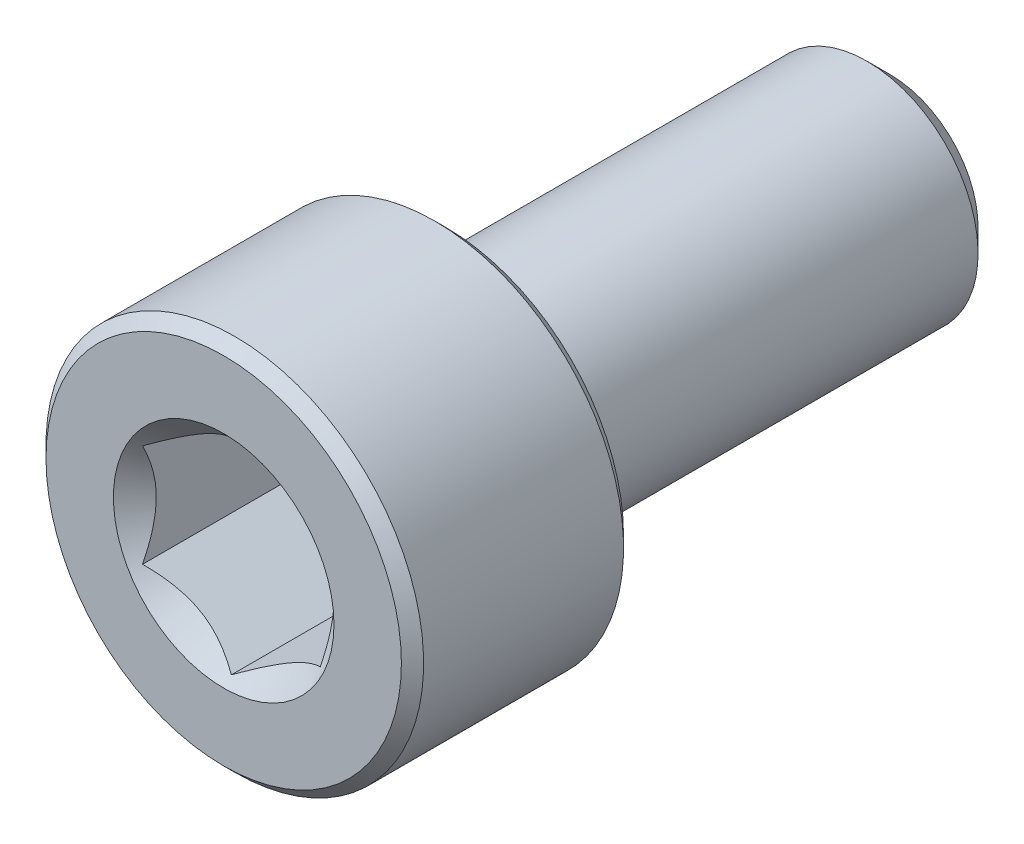
ISO-10303-21;
HEADER;
FILE_DESCRIPTION(('STEP AP214'),'2;1');
FILE_NAME('part.step','',(''),(''),'','','');
FILE_SCHEMA(('AUTOMOTIVE_DESIGN { 1 0 10303 214 1 1 1 1 }'));
ENDSEC;
DATA;
#1=APPLICATION_CONTEXT('core data for automotive mechanical design processes');
#2=APPLICATION_PROTOCOL_DEFINITION('international standard','automotive_design',2000,#1);
#3=PRODUCT_CONTEXT('',#1,'mechanical');
#4=PRODUCT('Part','Part','',(#3));
#5=PRODUCT_RELATED_PRODUCT_CATEGORY('part','',(#4));
#6=PRODUCT_DEFINITION_FORMATION('','',#4);
#7=PRODUCT_DEFINITION_CONTEXT('part definition',#1,'design');
#8=PRODUCT_DEFINITION('design','',#6,#7);
#9=PRODUCT_DEFINITION_SHAPE('','',#8);
#10=(LENGTH_UNIT() NAMED_UNIT(*) SI_UNIT(.MILLI.,.METRE.));
#11=(NAMED_UNIT(*) PLANE_ANGLE_UNIT() SI_UNIT($,.RADIAN.));
#12=(NAMED_UNIT(*) SI_UNIT($,.STERADIAN.) SOLID_ANGLE_UNIT());
#13=UNCERTAINTY_MEASURE_WITH_UNIT(LENGTH_MEASURE(1.E-05),#10,'distance_accuracy_value','');
#14=(GEOMETRIC_REPRESENTATION_CONTEXT(3) GLOBAL_UNCERTAINTY_ASSIGNED_CONTEXT((#13)) GLOBAL_UNIT_ASSIGNED_CONTEXT((#10,
#11,#12)) REPRESENTATION_CONTEXT('',''));
#15=CARTESIAN_POINT('',(0.,0.,0.));
#16=DIRECTION('',(0.,0.,1.));
#17=DIRECTION('',(1.,0.,0.));
#18=AXIS2_PLACEMENT_3D('',#15,#16,#17);
#19=CARTESIAN_POINT('',(0.,1.98038475772934,-7.5));
#20=DIRECTION('',(0.,0.,-1.));
#21=DIRECTION('',(0.,1.,0.));
#22=AXIS2_PLACEMENT_3D('',#19,#20,#21);
#23=PLANE('',#22);
#24=CARTESIAN_POINT('',(0.,0.,-7.5));
#25=DIRECTION('',(0.,0.,-1.));
#26=DIRECTION('',(0.,1.,0.));
#27=AXIS2_PLACEMENT_3D('',#24,#25,#26);
#28=CIRCLE('',#27,1.98038475772934);
#29=CARTESIAN_POINT('',(0.,1.98038475772934,-7.5));
#30=VERTEX_POINT('',#29);
#31=EDGE_CURVE('E48',#30,#30,#28,.T.);
#32=ORIENTED_EDGE('',*,*,#31,.T.);
#33=EDGE_LOOP('',(#32));
#34=FACE_BOUND('',#33,.T.);
#35=ADVANCED_FACE('F35',(#34),#23,.T.);
#36=CARTESIAN_POINT('',(0.,0.,-7.5));
#37=DIRECTION('',(0.,0.,1.));
#38=DIRECTION('',(0.,-1.,0.));
#39=AXIS2_PLACEMENT_3D('',#36,#37,#38);
#40=CONICAL_SURFACE('',#39,1.98038475772934,0.785398163397446);
#41=CARTESIAN_POINT('',(0.,0.,-6.98038475772933));
#42=DIRECTION('',(0.,0.,-1.));
#43=DIRECTION('',(0.,1.,0.));
#44=AXIS2_PLACEMENT_3D('',#41,#42,#43);
#45=CIRCLE('',#44,2.5);
#46=CARTESIAN_POINT('',(0.,2.5,-6.98038475772933));
#47=VERTEX_POINT('',#46);
#48=EDGE_CURVE('E151',#47,#47,#45,.T.);
#49=ORIENTED_EDGE('',*,*,#48,.T.);
#50=EDGE_LOOP('',(#49));
#51=FACE_BOUND('',#50,.T.);
#52=ORIENTED_EDGE('',*,*,#31,.F.);
#53=EDGE_LOOP('',(#52));
#54=FACE_BOUND('',#53,.T.);
#55=ADVANCED_FACE('F157',(#51,#54),#40,.T.);
#56=CARTESIAN_POINT('',(0.,0.,-7.5));
#57=DIRECTION('',(0.,0.,-1.));
#58=DIRECTION('',(0.,1.,0.));
#59=AXIS2_PLACEMENT_3D('',#56,#57,#58);
#60=CYLINDRICAL_SURFACE('',#59,2.5);
#61=CARTESIAN_POINT('',(0.,0.,2.25));
#62=DIRECTION('',(0.,0.,-1.));
#63=DIRECTION('',(0.,1.,0.));
#64=AXIS2_PLACEMENT_3D('',#61,#62,#63);
#65=CIRCLE('',#64,2.5);
#66=CARTESIAN_POINT('',(0.,2.5,2.25));
#67=VERTEX_POINT('',#66);
#68=EDGE_CURVE('E148',#67,#67,#65,.T.);
#69=ORIENTED_EDGE('',*,*,#68,.T.);
#70=EDGE_LOOP('',(#69));
#71=FACE_BOUND('',#70,.T.);
#72=ORIENTED_EDGE('',*,*,#48,.F.);
#73=EDGE_LOOP('',(#72));
#74=FACE_BOUND('',#73,.T.);
#75=ADVANCED_FACE('F159',(#71,#74),#60,.T.);
#76=CARTESIAN_POINT('',(0.,0.,2.25));
#77=DIRECTION('',(0.,0.,-1.));
#78=DIRECTION('',(0.,1.,0.));
#79=AXIS2_PLACEMENT_3D('',#76,#77,#78);
#80=TOROIDAL_SURFACE('',#79,2.75,0.25);
#81=CARTESIAN_POINT('',(0.,0.,2.5));
#82=DIRECTION('',(0.,0.,-1.));
#83=DIRECTION('',(0.,1.,0.));
#84=AXIS2_PLACEMENT_3D('',#81,#82,#83);
#85=CIRCLE('',#84,2.75);
#86=CARTESIAN_POINT('',(0.,2.75,2.5));
#87=VERTEX_POINT('',#86);
#88=EDGE_CURVE('E145',#87,#87,#85,.T.);
#89=ORIENTED_EDGE('',*,*,#88,.T.);
#90=EDGE_LOOP('',(#89));
#91=FACE_BOUND('',#90,.T.);
#92=ORIENTED_EDGE('',*,*,#68,.F.);
#93=EDGE_LOOP('',(#92));
#94=FACE_BOUND('',#93,.T.);
#95=ADVANCED_FACE('F165',(#91,#94),#80,.F.);
#96=CARTESIAN_POINT('',(0.,4.,2.5));
#97=DIRECTION('',(0.,0.,-1.));
#98=DIRECTION('',(0.,1.,0.));
#99=AXIS2_PLACEMENT_3D('',#96,#97,#98);
#100=PLANE('',#99);
#101=CARTESIAN_POINT('',(0.,0.,2.5));
#102=DIRECTION('',(0.,0.,-1.));
#103=DIRECTION('',(0.,1.,0.));
#104=AXIS2_PLACEMENT_3D('',#101,#102,#103);
#105=CIRCLE('',#104,4.);
#106=CARTESIAN_POINT('',(0.,4.,2.5));
#107=VERTEX_POINT('',#106);
#108=EDGE_CURVE('E142',#107,#107,#105,.T.);
#109=ORIENTED_EDGE('',*,*,#108,.T.);
#110=EDGE_LOOP('',(#109));
#111=FACE_BOUND('',#110,.T.);
#112=ORIENTED_EDGE('',*,*,#88,.F.);
#113=EDGE_LOOP('',(#112));
#114=FACE_BOUND('',#113,.T.);
#115=ADVANCED_FACE('F171',(#111,#114),#100,.T.);
#116=CARTESIAN_POINT('',(0.,0.,2.5));
#117=DIRECTION('',(0.,0.,1.));
#118=DIRECTION('',(0.,-1.,0.));
#119=AXIS2_PLACEMENT_3D('',#116,#117,#118);
#120=CONICAL_SURFACE('',#119,4.,0.785398163397448);
#121=CARTESIAN_POINT('',(0.,0.,2.75));
#122=DIRECTION('',(0.,0.,-1.));
#123=DIRECTION('',(0.,1.,0.));
#124=AXIS2_PLACEMENT_3D('',#121,#122,#123);
#125=CIRCLE('',#124,4.25);
#126=CARTESIAN_POINT('',(0.,4.25,2.75));
#127=VERTEX_POINT('',#126);
#128=EDGE_CURVE('E139',#127,#127,#125,.T.);
#129=ORIENTED_EDGE('',*,*,#128,.T.);
#130=EDGE_LOOP('',(#129));
#131=FACE_BOUND('',#130,.T.);
#132=ORIENTED_EDGE('',*,*,#108,.F.);
#133=EDGE_LOOP('',(#132));
#134=FACE_BOUND('',#133,.T.);
#135=ADVANCED_FACE('F175',(#131,#134),#120,.T.);
#136=CARTESIAN_POINT('',(0.,0.,-7.5));
#137=DIRECTION('',(0.,0.,-1.));
#138=DIRECTION('',(0.,1.,0.));
#139=AXIS2_PLACEMENT_3D('',#136,#137,#138);
#140=CYLINDRICAL_SURFACE('',#139,4.25);
#141=CARTESIAN_POINT('',(0.,0.,7.25));
#142=DIRECTION('',(0.,0.,-1.));
#143=DIRECTION('',(0.,1.,0.));
#144=AXIS2_PLACEMENT_3D('',#141,#142,#143);
#145=CIRCLE('',#144,4.25);
#146=CARTESIAN_POINT('',(0.,4.25,7.25));
#147=VERTEX_POINT('',#146);
#148=EDGE_CURVE('E136',#147,#147,#145,.T.);
#149=ORIENTED_EDGE('',*,*,#148,.T.);
#150=EDGE_LOOP('',(#149));
#151=FACE_BOUND('',#150,.T.);
#152=ORIENTED_EDGE('',*,*,#128,.F.);
#153=EDGE_LOOP('',(#152));
#154=FACE_BOUND('',#153,.T.);
#155=ADVANCED_FACE('F179',(#151,#154),#140,.T.);
#156=CARTESIAN_POINT('',(0.,0.,7.25));
#157=DIRECTION('',(0.,0.,-1.));
#158=DIRECTION('',(0.,1.,0.));
#159=AXIS2_PLACEMENT_3D('',#156,#157,#158);
#160=CONICAL_SURFACE('',#159,4.25,0.785398163397448);
#161=CARTESIAN_POINT('',(0.,0.,7.5));
#162=DIRECTION('',(0.,0.,-1.));
#163=DIRECTION('',(0.,1.,0.));
#164=AXIS2_PLACEMENT_3D('',#161,#162,#163);
#165=CIRCLE('',#164,4.);
#166=CARTESIAN_POINT('',(0.,4.,7.5));
#167=VERTEX_POINT('',#166);
#168=EDGE_CURVE('E133',#167,#167,#165,.T.);
#169=ORIENTED_EDGE('',*,*,#168,.T.);
#170=EDGE_LOOP('',(#169));
#171=FACE_BOUND('',#170,.T.);
#172=ORIENTED_EDGE('',*,*,#148,.F.);
#173=EDGE_LOOP('',(#172));
#174=FACE_BOUND('',#173,.T.);
#175=ADVANCED_FACE('F183',(#171,#174),#160,.T.);
#176=CARTESIAN_POINT('',(0.,0.,7.5));
#177=DIRECTION('',(0.,0.,1.));
#178=DIRECTION('',(0.,-1.,0.));
#179=AXIS2_PLACEMENT_3D('',#176,#177,#178);
#180=PLANE('',#179);
#181=CARTESIAN_POINT('',(0.,0.,7.5));
#182=DIRECTION('',(0.,0.,1.));
#183=DIRECTION('',(1.,0.,0.));
#184=AXIS2_PLACEMENT_3D('',#181,#182,#183);
#185=CIRCLE('',#184,2.48260615751539);
#186=CARTESIAN_POINT('',(2.48260615751539,0.,7.5));
#187=VERTEX_POINT('',#186);
#188=EDGE_CURVE('E107',#187,#187,#185,.T.);
#189=ORIENTED_EDGE('',*,*,#188,.F.);
#190=EDGE_LOOP('',(#189));
#191=FACE_BOUND('',#190,.T.);
#192=ORIENTED_EDGE('',*,*,#168,.F.);
#193=EDGE_LOOP('',(#192));
#194=FACE_BOUND('',#193,.T.);
#195=ADVANCED_FACE('F187',(#191,#194),#180,.T.);
#196=CARTESIAN_POINT('',(0.,0.,7.5));
#197=DIRECTION('',(0.,0.,1.));
#198=DIRECTION('',(1.,0.,0.));
#199=AXIS2_PLACEMENT_3D('',#196,#197,#198);
#200=CONICAL_SURFACE('',#199,2.48260615751539,0.78539816339745);
#201=ORIENTED_EDGE('',*,*,#188,.T.);
#202=EDGE_LOOP('',(#201));
#203=FACE_BOUND('',#202,.T.);
#204=CARTESIAN_POINT('',(-0.000199999999998729,-2.30951654681234,7.32691039795677));
#205=CARTESIAN_POINT('',(0.0685530340307071,-2.26982196410711,7.28724800946871));
#206=CARTESIAN_POINT('',(0.138455742135513,-2.22946361676572,7.24991490152728));
#207=CARTESIAN_POINT('',(0.280995244550438,-2.1471683966763,7.18155860437926));
#208=CARTESIAN_POINT('',(0.35364559756536,-2.10522369580642,7.15057345298033));
#209=CARTESIAN_POINT('',(0.500141601053973,-2.02064418875706,7.09749513578726));
#210=CARTESIAN_POINT('',(0.573949935246296,-1.97803092714269,7.07526854641972));
#211=CARTESIAN_POINT('',(0.723191631835265,-1.89186619344273,7.04102373591819));
#212=CARTESIAN_POINT('',(0.798620433918153,-1.84831735425552,7.02897994838725));
#213=CARTESIAN_POINT('',(0.92861550067108,-1.7732646674724,7.01811343114868));
#214=CARTESIAN_POINT('',(0.98301378397011,-1.74185780396625,7.01650467285308));
#215=CARTESIAN_POINT('',(1.09172145551969,-1.67909540053412,7.01921379684182));
#216=CARTESIAN_POINT('',(1.14603080592134,-1.64773988246021,7.02353375700109));
#217=CARTESIAN_POINT('',(1.25413672758934,-1.5853248994842,7.03785448665302));
#218=CARTESIAN_POINT('',(1.30793265655479,-1.55426580541469,7.04786161200512));
#219=CARTESIAN_POINT('',(1.41459426230557,-1.49268469862228,7.07300734949277));
#220=CARTESIAN_POINT('',(1.46746001007071,-1.46216264491917,7.08814556828535));
#221=CARTESIAN_POINT('',(1.60287973308984,-1.38397803138049,7.1330894226723));
#222=CARTESIAN_POINT('',(1.68459383484948,-1.33680037273297,7.16628375866893));
#223=CARTESIAN_POINT('',(1.8047470372578,-1.26742988897853,7.22232074241448));
#224=CARTESIAN_POINT('',(1.84434285210918,-1.24456923461531,7.24200962219005));
#225=CARTESIAN_POINT('',(1.92280095888787,-1.19927142554652,7.28318223760798));
#226=CARTESIAN_POINT('',(1.96166368359374,-1.17683402097614,7.30466487089436));
#227=CARTESIAN_POINT('',(2.0002,-1.15458506832541,7.32691039795677));
#228=B_SPLINE_CURVE_WITH_KNOTS('',3,(#204,#205,#206,#207,#208,#209,#210,#211,#212,#213,#214,
#215,#216,#217,#218,#219,#220,#221,#222,#223,#224,#225,#226,#227),.UNSPECIFIED.,.F.,.F.,(4,2,2,
2,2,2,2,2,2,2,2,4),(0.,0.266420613771064,0.534393751523389,0.798110374376915,1.06116288956936,
1.24939906803722,1.43770123566247,1.62621426093932,1.81471283831913,2.11415604834145,
2.2634717071779,2.41269626969771),.UNSPECIFIED.);
#229=CARTESIAN_POINT('',(0.,-2.3094010767585,7.32679491924311));
#230=VERTEX_POINT('',#229);
#231=CARTESIAN_POINT('',(2.,-1.15470053837925,7.32679491924311));
#232=VERTEX_POINT('',#231);
#233=EDGE_CURVE('E12',#230,#232,#228,.T.);
#234=ORIENTED_EDGE('',*,*,#233,.F.);
#235=CARTESIAN_POINT('',(-2.0002,-1.15458506832541,7.32691039795677));
#236=CARTESIAN_POINT('',(-1.93144696596929,-1.19427965103064,7.2872480094687));
#237=CARTESIAN_POINT('',(-1.86154425786449,-1.23463799837204,7.24991490152727));
#238=CARTESIAN_POINT('',(-1.71900475544956,-1.31693321846145,7.18155860437925));
#239=CARTESIAN_POINT('',(-1.64635440243464,-1.35887791933134,7.15057345298033));
#240=CARTESIAN_POINT('',(-1.49985839894603,-1.44345742638069,7.09749513578726));
#241=CARTESIAN_POINT('',(-1.42605006475371,-1.48607068799507,7.07526854641972));
#242=CARTESIAN_POINT('',(-1.27680836816474,-1.57223542169503,7.04102373591819));
#243=CARTESIAN_POINT('',(-1.20137956608185,-1.61578426088223,7.02897994838725));
#244=CARTESIAN_POINT('',(-1.07138449932892,-1.69083694766536,7.01811343114868));
#245=CARTESIAN_POINT('',(-1.01698621602989,-1.72224381117151,7.01650467285308));
#246=CARTESIAN_POINT('',(-0.908278544480306,-1.78500621460364,7.01921379684182));
#247=CARTESIAN_POINT('',(-0.853969194078661,-1.81636173267754,7.02353375700109));
#248=CARTESIAN_POINT('',(-0.745863272410662,-1.87877671565355,7.03785448665302));
#249=CARTESIAN_POINT('',(-0.692067343445208,-1.90983580972306,7.04786161200512));
#250=CARTESIAN_POINT('',(-0.585405737694426,-1.97141691651547,7.07300734949277));
#251=CARTESIAN_POINT('',(-0.532539989929287,-2.00193897021859,7.08814556828535));
#252=CARTESIAN_POINT('',(-0.397120266910155,-2.08012358375727,7.1330894226723));
#253=CARTESIAN_POINT('',(-0.315406165150521,-2.12730124240478,7.16628375866893));
#254=CARTESIAN_POINT('',(-0.195252962742197,-2.19667172615922,7.22232074241448));
#255=CARTESIAN_POINT('',(-0.155657147890822,-2.21953238052245,7.24200962219005));
#256=CARTESIAN_POINT('',(-0.0771990411121267,-2.26483018959124,7.28318223760798));
#257=CARTESIAN_POINT('',(-0.0383363164062587,-2.28726759416161,7.30466487089436));
#258=CARTESIAN_POINT('',(0.000200000000000952,-2.30951654681234,7.32691039795677));
#259=B_SPLINE_CURVE_WITH_KNOTS('',3,(#235,#236,#237,#238,#239,#240,#241,#242,#243,#244,#245,
#246,#247,#248,#249,#250,#251,#252,#253,#254,#255,#256,#257,#258),.UNSPECIFIED.,.F.,.F.,(4,2,2,
2,2,2,2,2,2,2,2,4),(0.,0.266420613771063,0.534393751523388,0.798110374376914,1.06116288956936,
1.24939906803722,1.43770123566247,1.62621426093932,1.81471283831913,2.11415604834145,
2.26347170717791,2.41269626969771),.UNSPECIFIED.);
#260=CARTESIAN_POINT('',(-2.,-1.15470053837925,7.32679491924311));
#261=VERTEX_POINT('',#260);
#262=EDGE_CURVE('E93',#261,#230,#259,.T.);
#263=ORIENTED_EDGE('',*,*,#262,.F.);
#264=CARTESIAN_POINT('',(-2.,-2.42398175579868,8.15995451054574));
#265=CARTESIAN_POINT('',(-2.,-2.3654738763041,8.11483517587132));
#266=CARTESIAN_POINT('',(-2.,-2.30665236661135,8.07011617562649));
#267=CARTESIAN_POINT('',(-2.,-2.18825331969085,7.98166221214179));
#268=CARTESIAN_POINT('',(-2.,-2.12867560822125,7.93792748237708));
#269=CARTESIAN_POINT('',(-2.,-2.00820019262835,7.85131424628961));
#270=CARTESIAN_POINT('',(-2.,-1.94729585350119,7.80844493894837));
#271=CARTESIAN_POINT('',(-2.,-1.82447635639412,7.72418465016678));
#272=CARTESIAN_POINT('',(-2.,-1.76256126823391,7.6827935672392));
#273=CARTESIAN_POINT('',(-2.,-1.63352305153315,7.59921996484665));
#274=CARTESIAN_POINT('',(-2.,-1.56632133333278,7.55715817993554));
#275=CARTESIAN_POINT('',(-2.,-1.43035896394453,7.47563838893648));
#276=CARTESIAN_POINT('',(-2.,-1.3615985170145,7.43618004431012));
#277=CARTESIAN_POINT('',(-2.,-1.22246684398892,7.36068636376272));
#278=CARTESIAN_POINT('',(-2.,-1.15210085009344,7.32464146052515));
#279=CARTESIAN_POINT('',(-2.,-1.00937086384545,7.25678893834465));
#280=CARTESIAN_POINT('',(-2.,-0.9370078386482,7.224979310286));
#281=CARTESIAN_POINT('',(-2.,-0.797532850709094,7.16969189966866));
#282=CARTESIAN_POINT('',(-2.,-0.730627867984569,7.14569726163853));
#283=CARTESIAN_POINT('',(-2.,-0.595101218410188,7.10306213740658));
#284=CARTESIAN_POINT('',(-2.,-0.526479443554563,7.08442198898856));
#285=CARTESIAN_POINT('',(-2.,-0.389131528451131,7.05382052551661));
#286=CARTESIAN_POINT('',(-2.,-0.320433088583213,7.04173698158651));
#287=CARTESIAN_POINT('',(-2.,-0.182167175628636,7.02450292592166));
#288=CARTESIAN_POINT('',(-2.,-0.112599890436882,7.01935094051314));
#289=CARTESIAN_POINT('',(-2.,0.0235742388197041,7.01642612364862));
#290=CARTESIAN_POINT('',(-2.,0.090174262254322,7.01833341863494));
#291=CARTESIAN_POINT('',(-2.,0.22286064727918,7.02868442599921));
#292=CARTESIAN_POINT('',(-2.,0.288946962142557,7.037128726115));
#293=CARTESIAN_POINT('',(-2.,0.421249515605842,7.06021695445483));
#294=CARTESIAN_POINT('',(-2.,0.487446247340619,7.07497086973096));
#295=CARTESIAN_POINT('',(-2.,0.61837553918038,7.10985799828159));
#296=CARTESIAN_POINT('',(-2.,0.683108176846778,7.12999092587173));
#297=CARTESIAN_POINT('',(-2.,0.881750195572362,7.199485149858));
#298=CARTESIAN_POINT('',(-2.,1.01295821830486,7.25654000335251));
#299=CARTESIAN_POINT('',(-2.,1.26925973679032,7.38351839679612));
#300=CARTESIAN_POINT('',(-2.,1.39432972284544,7.45348716600113));
#301=CARTESIAN_POINT('',(-2.,1.57512870977373,7.56276445486535));
#302=CARTESIAN_POINT('',(-2.,1.63281357796871,7.59890122417869));
#303=CARTESIAN_POINT('',(-2.,1.74719269140407,7.67272160993031));
#304=CARTESIAN_POINT('',(-2.,1.80388686201492,7.71040534219169));
#305=CARTESIAN_POINT('',(-2.,1.91595826038669,7.7867305219709));
#306=CARTESIAN_POINT('',(-2.,1.97134240267412,7.82536186770479));
#307=CARTESIAN_POINT('',(-2.,2.08135060816028,7.90366155436872));
#308=CARTESIAN_POINT('',(-2.,2.13597487670731,7.94332960645661));
#309=CARTESIAN_POINT('',(-2.,2.19028039622781,7.98342287371472));
#310=B_SPLINE_CURVE_WITH_KNOTS('',3,(#264,#265,#266,#267,#268,#269,#270,#271,#272,#273,#274,
#275,#276,#277,#278,#279,#280,#281,#282,#283,#284,#285,#286,#287,#288,#289,#290,#291,#292,#293,
#294,#295,#296,#297,#298,#299,#300,#301,#302,#303,#304,#305,#306,#307,#308,#309),.UNSPECIFIED.,
.F.,.F.,(4,2,2,2,2,2,2,2,2,2,2,2,2,2,2,2,2,2,2,2,2,2,4),(0.,0.221657667100339,0.443367370127324,
0.666786125723387,0.890189512941441,1.12798201434515,1.36574353320624,1.60281759521649,
1.83977879106023,2.05282811904838,2.26589088413717,2.47483185958037,2.68372840641278,
2.88327763021218,3.08284479743513,3.28604242448891,3.48922926167214,3.91721633282416,
4.34673183999753,4.55091998635568,4.75512344852471,4.95768958131487,5.1601998654356),.UNSPECIFIED.);
#311=CARTESIAN_POINT('',(-2.,1.15470053837925,7.32679491924311));
#312=VERTEX_POINT('',#311);
#313=EDGE_CURVE('E106',#312,#261,#310,.F.);
#314=ORIENTED_EDGE('',*,*,#313,.F.);
#315=CARTESIAN_POINT('',(0.000199999999999599,2.30951654681234,7.32691039795677));
#316=CARTESIAN_POINT('',(-0.0685530340307059,2.26982196410711,7.2872480094687));
#317=CARTESIAN_POINT('',(-0.138455742135512,2.22946361676572,7.24991490152727));
#318=CARTESIAN_POINT('',(-0.280995244550437,2.1471683966763,7.18155860437925));
#319=CARTESIAN_POINT('',(-0.353645597565359,2.10522369580642,7.15057345298033));
#320=CARTESIAN_POINT('',(-0.500141601053972,2.02064418875706,7.09749513578726));
#321=CARTESIAN_POINT('',(-0.573949935246295,1.97803092714269,7.07526854641972));
#322=CARTESIAN_POINT('',(-0.723191631835265,1.89186619344273,7.04102373591819));
#323=CARTESIAN_POINT('',(-0.798620433918153,1.84831735425552,7.02897994838725));
#324=CARTESIAN_POINT('',(-0.92861550067108,1.7732646674724,7.01811343114868));
#325=CARTESIAN_POINT('',(-0.98301378397011,1.74185780396625,7.01650467285308));
#326=CARTESIAN_POINT('',(-1.09172145551969,1.67909540053412,7.01921379684182));
#327=CARTESIAN_POINT('',(-1.14603080592134,1.64773988246021,7.02353375700109));
#328=CARTESIAN_POINT('',(-1.25413672758934,1.5853248994842,7.03785448665302));
#329=CARTESIAN_POINT('',(-1.30793265655479,1.55426580541469,7.04786161200512));
#330=CARTESIAN_POINT('',(-1.41459426230557,1.49268469862228,7.07300734949277));
#331=CARTESIAN_POINT('',(-1.46746001007071,1.46216264491916,7.08814556828535));
#332=CARTESIAN_POINT('',(-1.60287973308985,1.38397803138048,7.1330894226723));
#333=CARTESIAN_POINT('',(-1.68459383484948,1.33680037273297,7.16628375866893));
#334=CARTESIAN_POINT('',(-1.8047470372578,1.26742988897853,7.22232074241448));
#335=CARTESIAN_POINT('',(-1.84434285210918,1.24456923461531,7.24200962219005));
#336=CARTESIAN_POINT('',(-1.92280095888787,1.19927142554652,7.28318223760798));
#337=CARTESIAN_POINT('',(-1.96166368359374,1.17683402097614,7.30466487089436));
#338=CARTESIAN_POINT('',(-2.0002,1.15458506832541,7.32691039795677));
#339=B_SPLINE_CURVE_WITH_KNOTS('',3,(#315,#316,#317,#318,#319,#320,#321,#322,#323,#324,#325,
#326,#327,#328,#329,#330,#331,#332,#333,#334,#335,#336,#337,#338),.UNSPECIFIED.,.F.,.F.,(4,2,2,
2,2,2,2,2,2,2,2,4),(0.,0.266420613771064,0.534393751523389,0.798110374376915,1.06116288956936,
1.24939906803722,1.43770123566247,1.62621426093932,1.81471283831913,2.11415604834145,
2.2634717071779,2.41269626969771),.UNSPECIFIED.);
#340=CARTESIAN_POINT('',(0.,2.3094010767585,7.32679491924311));
#341=VERTEX_POINT('',#340);
#342=EDGE_CURVE('E237',#341,#312,#339,.T.);
#343=ORIENTED_EDGE('',*,*,#342,.F.);
#344=CARTESIAN_POINT('',(2.0002,1.15458506832541,7.32691039795677));
#345=CARTESIAN_POINT('',(1.93144696596929,1.19427965103064,7.2872480094687));
#346=CARTESIAN_POINT('',(1.86154425786449,1.23463799837204,7.24991490152727));
#347=CARTESIAN_POINT('',(1.71900475544956,1.31693321846145,7.18155860437925));
#348=CARTESIAN_POINT('',(1.64635440243464,1.35887791933134,7.15057345298033));
#349=CARTESIAN_POINT('',(1.49985839894603,1.44345742638069,7.09749513578725));
#350=CARTESIAN_POINT('',(1.42605006475371,1.48607068799507,7.07526854641972));
#351=CARTESIAN_POINT('',(1.27680836816474,1.57223542169503,7.04102373591819));
#352=CARTESIAN_POINT('',(1.20137956608185,1.61578426088223,7.02897994838725));
#353=CARTESIAN_POINT('',(1.07138449932892,1.69083694766536,7.01811343114868));
#354=CARTESIAN_POINT('',(1.01698621602989,1.72224381117151,7.01650467285308));
#355=CARTESIAN_POINT('',(0.908278544480305,1.78500621460364,7.01921379684182));
#356=CARTESIAN_POINT('',(0.85396919407866,1.81636173267754,7.02353375700109));
#357=CARTESIAN_POINT('',(0.745863272410661,1.87877671565355,7.03785448665302));
#358=CARTESIAN_POINT('',(0.692067343445206,1.90983580972306,7.04786161200512));
#359=CARTESIAN_POINT('',(0.585405737694425,1.97141691651547,7.07300734949277));
#360=CARTESIAN_POINT('',(0.532539989929286,2.00193897021859,7.08814556828535));
#361=CARTESIAN_POINT('',(0.397120266910155,2.08012358375727,7.1330894226723));
#362=CARTESIAN_POINT('',(0.31540616515052,2.12730124240478,7.16628375866893));
#363=CARTESIAN_POINT('',(0.195252962742197,2.19667172615922,7.22232074241448));
#364=CARTESIAN_POINT('',(0.155657147890822,2.21953238052245,7.24200962219005));
#365=CARTESIAN_POINT('',(0.077199041112127,2.26483018959124,7.28318223760798));
#366=CARTESIAN_POINT('',(0.0383363164062592,2.28726759416161,7.30466487089436));
#367=CARTESIAN_POINT('',(-0.000200000000000241,2.30951654681234,7.32691039795677));
#368=B_SPLINE_CURVE_WITH_KNOTS('',3,(#344,#345,#346,#347,#348,#349,#350,#351,#352,#353,#354,
#355,#356,#357,#358,#359,#360,#361,#362,#363,#364,#365,#366,#367),.UNSPECIFIED.,.F.,.F.,(4,2,2,
2,2,2,2,2,2,2,2,4),(0.,0.266420613771064,0.534393751523389,0.798110374376915,1.06116288956936,
1.24939906803722,1.43770123566248,1.62621426093932,1.81471283831913,2.11415604834145,
2.26347170717791,2.41269626969771),.UNSPECIFIED.);
#369=CARTESIAN_POINT('',(2.,1.15470053837925,7.32679491924311));
#370=VERTEX_POINT('',#369);
#371=EDGE_CURVE('E210',#370,#341,#368,.T.);
#372=ORIENTED_EDGE('',*,*,#371,.F.);
#373=CARTESIAN_POINT('',(2.,-2.42398175579868,8.15995451054574));
#374=CARTESIAN_POINT('',(2.,-2.3654738763041,8.11483517587132));
#375=CARTESIAN_POINT('',(2.,-2.30665236661135,8.07011617562649));
#376=CARTESIAN_POINT('',(2.,-2.18825331969084,7.98166221214179));
#377=CARTESIAN_POINT('',(2.,-2.12867560822125,7.93792748237708));
#378=CARTESIAN_POINT('',(2.,-2.00820019262835,7.85131424628961));
#379=CARTESIAN_POINT('',(2.,-1.94729585350119,7.80844493894837));
#380=CARTESIAN_POINT('',(2.,-1.82447635639412,7.72418465016678));
#381=CARTESIAN_POINT('',(2.,-1.76256126823391,7.6827935672392));
#382=CARTESIAN_POINT('',(2.,-1.63352305153315,7.59921996484665));
#383=CARTESIAN_POINT('',(2.,-1.56632133333278,7.55715817993554));
#384=CARTESIAN_POINT('',(2.,-1.43035896394453,7.47563838893648));
#385=CARTESIAN_POINT('',(2.,-1.3615985170145,7.43618004431012));
#386=CARTESIAN_POINT('',(2.,-1.22246684398892,7.36068636376272));
#387=CARTESIAN_POINT('',(2.,-1.15210085009344,7.32464146052515));
#388=CARTESIAN_POINT('',(2.,-1.00937086384545,7.25678893834465));
#389=CARTESIAN_POINT('',(2.,-0.9370078386482,7.224979310286));
#390=CARTESIAN_POINT('',(2.,-0.797532850709094,7.16969189966866));
#391=CARTESIAN_POINT('',(2.,-0.730627867984569,7.14569726163853));
#392=CARTESIAN_POINT('',(2.,-0.595101218410188,7.10306213740658));
#393=CARTESIAN_POINT('',(2.,-0.526479443554563,7.08442198898856));
#394=CARTESIAN_POINT('',(2.,-0.38913152845113,7.05382052551661));
#395=CARTESIAN_POINT('',(2.,-0.320433088583212,7.04173698158651));
#396=CARTESIAN_POINT('',(2.,-0.182167175628636,7.02450292592166));
#397=CARTESIAN_POINT('',(2.,-0.112599890436882,7.01935094051314));
#398=CARTESIAN_POINT('',(2.,0.0235742388197046,7.01642612364862));
#399=CARTESIAN_POINT('',(2.,0.0901742622543224,7.01833341863494));
#400=CARTESIAN_POINT('',(2.,0.22286064727918,7.02868442599921));
#401=CARTESIAN_POINT('',(2.,0.288946962142557,7.037128726115));
#402=CARTESIAN_POINT('',(2.,0.421249515605843,7.06021695445483));
#403=CARTESIAN_POINT('',(2.,0.48744624734062,7.07497086973096));
#404=CARTESIAN_POINT('',(2.,0.618375539180381,7.10985799828159));
#405=CARTESIAN_POINT('',(2.,0.683108176846779,7.12999092587173));
#406=CARTESIAN_POINT('',(2.,0.881750195572363,7.199485149858));
#407=CARTESIAN_POINT('',(2.,1.01295821830486,7.25654000335251));
#408=CARTESIAN_POINT('',(2.,1.26925973679032,7.38351839679612));
#409=CARTESIAN_POINT('',(2.,1.39432972284545,7.45348716600114));
#410=CARTESIAN_POINT('',(2.,1.57512870977373,7.56276445486535));
#411=CARTESIAN_POINT('',(2.,1.63281357796872,7.59890122417869));
#412=CARTESIAN_POINT('',(2.,1.74719269140407,7.67272160993031));
#413=CARTESIAN_POINT('',(2.,1.80388686201493,7.71040534219169));
#414=CARTESIAN_POINT('',(2.,1.91595826038669,7.7867305219709));
#415=CARTESIAN_POINT('',(2.,1.97134240267412,7.82536186770479));
#416=CARTESIAN_POINT('',(2.,2.08135060816028,7.90366155436873));
#417=CARTESIAN_POINT('',(2.,2.13597487670731,7.94332960645662));
#418=CARTESIAN_POINT('',(2.,2.19028039622782,7.98342287371473));
#419=B_SPLINE_CURVE_WITH_KNOTS('',3,(#373,#374,#375,#376,#377,#378,#379,#380,#381,#382,#383,
#384,#385,#386,#387,#388,#389,#390,#391,#392,#393,#394,#395,#396,#397,#398,#399,#400,#401,#402,
#403,#404,#405,#406,#407,#408,#409,#410,#411,#412,#413,#414,#415,#416,#417,#418),.UNSPECIFIED.,
.F.,.F.,(4,2,2,2,2,2,2,2,2,2,2,2,2,2,2,2,2,2,2,2,2,2,4),(0.,0.221657667100338,0.443367370127323,
0.666786125723385,0.890189512941439,1.12798201434515,1.36574353320624,1.60281759521649,
1.83977879106023,2.05282811904838,2.26589088413717,2.47483185958036,2.68372840641278,
2.88327763021218,3.08284479743512,3.28604242448891,3.48922926167214,3.91721633282416,
4.34673183999753,4.55091998635568,4.75512344852471,4.95768958131487,5.1601998654356),.UNSPECIFIED.);
#420=EDGE_CURVE('E55',#232,#370,#419,.T.);
#421=ORIENTED_EDGE('',*,*,#420,.F.);
#422=EDGE_LOOP('',(#234,#263,#314,#343,#372,#421));
#423=FACE_BOUND('',#422,.T.);
#424=ADVANCED_FACE('F92',(#203,#423),#200,.F.);
#425=CARTESIAN_POINT('',(0.,4.,3.5));
#426=DIRECTION('',(0.,0.,-1.));
#427=DIRECTION('',(0.,1.,0.));
#428=AXIS2_PLACEMENT_3D('',#425,#426,#427);
#429=PLANE('',#428);
#430=DIRECTION('',(0.866025403784439,0.5,0.));
#431=VECTOR('',#430,1.);
#432=CARTESIAN_POINT('',(0.,-2.3094010767585,3.5));
#433=LINE('',#432,#431);
#434=CARTESIAN_POINT('',(0.,-2.3094010767585,3.5));
#435=VERTEX_POINT('',#434);
#436=CARTESIAN_POINT('',(2.,-1.15470053837925,3.5));
#437=VERTEX_POINT('',#436);
#438=EDGE_CURVE('E110',#435,#437,#433,.T.);
#439=ORIENTED_EDGE('',*,*,#438,.T.);
#440=DIRECTION('',(0.,1.,0.));
#441=VECTOR('',#440,1.);
#442=CARTESIAN_POINT('',(2.,-1.15470053837925,3.5));
#443=LINE('',#442,#441);
#444=CARTESIAN_POINT('',(2.,1.15470053837925,3.5));
#445=VERTEX_POINT('',#444);
#446=EDGE_CURVE('E62',#437,#445,#443,.T.);
#447=ORIENTED_EDGE('',*,*,#446,.T.);
#448=DIRECTION('',(-0.866025403784439,0.5,0.));
#449=VECTOR('',#448,1.);
#450=CARTESIAN_POINT('',(2.,1.15470053837925,3.5));
#451=LINE('',#450,#449);
#452=CARTESIAN_POINT('',(0.,2.3094010767585,3.5));
#453=VERTEX_POINT('',#452);
#454=EDGE_CURVE('E118',#445,#453,#451,.T.);
#455=ORIENTED_EDGE('',*,*,#454,.T.);
#456=DIRECTION('',(-0.866025403784438,-0.5,0.));
#457=VECTOR('',#456,1.);
#458=CARTESIAN_POINT('',(0.,2.3094010767585,3.5));
#459=LINE('',#458,#457);
#460=CARTESIAN_POINT('',(-2.,1.15470053837925,3.5));
#461=VERTEX_POINT('',#460);
#462=EDGE_CURVE('E125',#453,#461,#459,.T.);
#463=ORIENTED_EDGE('',*,*,#462,.T.);
#464=DIRECTION('',(0.,-1.,0.));
#465=VECTOR('',#464,1.);
#466=CARTESIAN_POINT('',(-2.,1.15470053837925,3.5));
#467=LINE('',#466,#465);
#468=CARTESIAN_POINT('',(-2.,-1.15470053837925,3.5));
#469=VERTEX_POINT('',#468);
#470=EDGE_CURVE('E121',#461,#469,#467,.T.);
#471=ORIENTED_EDGE('',*,*,#470,.T.);
#472=DIRECTION('',(0.866025403784439,-0.5,0.));
#473=VECTOR('',#472,1.);
#474=CARTESIAN_POINT('',(-2.,-1.15470053837925,3.5));
#475=LINE('',#474,#473);
#476=EDGE_CURVE('E111',#469,#435,#475,.T.);
#477=ORIENTED_EDGE('',*,*,#476,.T.);
#478=EDGE_LOOP('',(#439,#447,#455,#463,#471,#477));
#479=FACE_BOUND('',#478,.T.);
#480=ADVANCED_FACE('F192',(#479),#429,.F.);
#481=CARTESIAN_POINT('',(0.,-2.3094010767585,-3.61010092660779));
#482=DIRECTION('',(0.5,-0.866025403784438,0.));
#483=DIRECTION('',(0.866025403784439,0.5,0.));
#484=AXIS2_PLACEMENT_3D('',#481,#482,#483);
#485=PLANE('',#484);
#486=DIRECTION('',(0.,0.,1.));
#487=VECTOR('',#486,1.);
#488=CARTESIAN_POINT('',(0.,-2.3094010767585,-3.61010092660779));
#489=LINE('',#488,#487);
#490=EDGE_CURVE('E102',#435,#230,#489,.T.);
#491=ORIENTED_EDGE('',*,*,#490,.T.);
#492=ORIENTED_EDGE('',*,*,#233,.T.);
#493=DIRECTION('',(0.,0.,1.));
#494=VECTOR('',#493,1.);
#495=CARTESIAN_POINT('',(2.,-1.15470053837925,-3.61010092660779));
#496=LINE('',#495,#494);
#497=EDGE_CURVE('E113',#437,#232,#496,.T.);
#498=ORIENTED_EDGE('',*,*,#497,.F.);
#499=ORIENTED_EDGE('',*,*,#438,.F.);
#500=EDGE_LOOP('',(#491,#492,#498,#499));
#501=FACE_BOUND('',#500,.T.);
#502=ADVANCED_FACE('F109',(#501),#485,.F.);
#503=CARTESIAN_POINT('',(-2.,-1.15470053837925,-3.61010092660779));
#504=DIRECTION('',(-0.5,-0.866025403784438,0.));
#505=DIRECTION('',(0.866025403784439,-0.5,0.));
#506=AXIS2_PLACEMENT_3D('',#503,#504,#505);
#507=PLANE('',#506);
#508=DIRECTION('',(0.,0.,1.));
#509=VECTOR('',#508,1.);
#510=CARTESIAN_POINT('',(-2.,-1.15470053837925,-3.61010092660779));
#511=LINE('',#510,#509);
#512=EDGE_CURVE('E105',#469,#261,#511,.T.);
#513=ORIENTED_EDGE('',*,*,#512,.T.);
#514=ORIENTED_EDGE('',*,*,#262,.T.);
#515=ORIENTED_EDGE('',*,*,#490,.F.);
#516=ORIENTED_EDGE('',*,*,#476,.F.);
#517=EDGE_LOOP('',(#513,#514,#515,#516));
#518=FACE_BOUND('',#517,.T.);
#519=ADVANCED_FACE('F101',(#518),#507,.F.);
#520=CARTESIAN_POINT('',(-2.,1.15470053837925,-3.61010092660779));
#521=DIRECTION('',(-1.,0.,0.));
#522=DIRECTION('',(0.,0.,1.));
#523=AXIS2_PLACEMENT_3D('',#520,#521,#522);
#524=PLANE('',#523);
#525=DIRECTION('',(0.,0.,1.));
#526=VECTOR('',#525,1.);
#527=CARTESIAN_POINT('',(-2.,1.15470053837925,-3.61010092660779));
#528=LINE('',#527,#526);
#529=EDGE_CURVE('E122',#461,#312,#528,.T.);
#530=ORIENTED_EDGE('',*,*,#529,.T.);
#531=ORIENTED_EDGE('',*,*,#313,.T.);
#532=ORIENTED_EDGE('',*,*,#512,.F.);
#533=ORIENTED_EDGE('',*,*,#470,.F.);
#534=EDGE_LOOP('',(#530,#531,#532,#533));
#535=FACE_BOUND('',#534,.T.);
#536=ADVANCED_FACE('F246',(#535),#524,.F.);
#537=CARTESIAN_POINT('',(0.,2.3094010767585,-3.61010092660779));
#538=DIRECTION('',(-0.5,0.866025403784438,0.));
#539=DIRECTION('',(-0.866025403784438,-0.5,0.));
#540=AXIS2_PLACEMENT_3D('',#537,#538,#539);
#541=PLANE('',#540);
#542=DIRECTION('',(0.,0.,1.));
#543=VECTOR('',#542,1.);
#544=CARTESIAN_POINT('',(0.,2.3094010767585,-3.61010092660779));
#545=LINE('',#544,#543);
#546=EDGE_CURVE('E126',#453,#341,#545,.T.);
#547=ORIENTED_EDGE('',*,*,#546,.T.);
#548=ORIENTED_EDGE('',*,*,#342,.T.);
#549=ORIENTED_EDGE('',*,*,#529,.F.);
#550=ORIENTED_EDGE('',*,*,#462,.F.);
#551=EDGE_LOOP('',(#547,#548,#549,#550));
#552=FACE_BOUND('',#551,.T.);
#553=ADVANCED_FACE('F243',(#552),#541,.F.);
#554=CARTESIAN_POINT('',(2.,1.15470053837925,-3.61010092660779));
#555=DIRECTION('',(0.5,0.866025403784439,0.));
#556=DIRECTION('',(-0.866025403784439,0.5,0.));
#557=AXIS2_PLACEMENT_3D('',#554,#555,#556);
#558=PLANE('',#557);
#559=DIRECTION('',(0.,0.,1.));
#560=VECTOR('',#559,1.);
#561=CARTESIAN_POINT('',(2.,1.15470053837925,-3.61010092660779));
#562=LINE('',#561,#560);
#563=EDGE_CURVE('E129',#445,#370,#562,.T.);
#564=ORIENTED_EDGE('',*,*,#563,.T.);
#565=ORIENTED_EDGE('',*,*,#371,.T.);
#566=ORIENTED_EDGE('',*,*,#546,.F.);
#567=ORIENTED_EDGE('',*,*,#454,.F.);
#568=EDGE_LOOP('',(#564,#565,#566,#567));
#569=FACE_BOUND('',#568,.T.);
#570=ADVANCED_FACE('F200',(#569),#558,.F.);
#571=CARTESIAN_POINT('',(2.,-1.15470053837925,-3.61010092660779));
#572=DIRECTION('',(1.,0.,0.));
#573=DIRECTION('',(0.,0.,-1.));
#574=AXIS2_PLACEMENT_3D('',#571,#572,#573);
#575=PLANE('',#574);
#576=ORIENTED_EDGE('',*,*,#497,.T.);
#577=ORIENTED_EDGE('',*,*,#420,.T.);
#578=ORIENTED_EDGE('',*,*,#563,.F.);
#579=ORIENTED_EDGE('',*,*,#446,.F.);
#580=EDGE_LOOP('',(#576,#577,#578,#579));
#581=FACE_BOUND('',#580,.T.);
#582=ADVANCED_FACE('F196',(#581),#575,.F.);
#583=CLOSED_SHELL('',(#35,#55,#75,#95,#115,#135,#155,#175,#195,#424,#480,#502,#519,#536,#553,
#570,#582));
#584=MANIFOLD_SOLID_BREP('B2',#583);
#585=ADVANCED_BREP_SHAPE_REPRESENTATION('',(#18,#584),#14);
#586=SHAPE_DEFINITION_REPRESENTATION(#9,#585);
ENDSEC;
END-ISO-10303-21;
